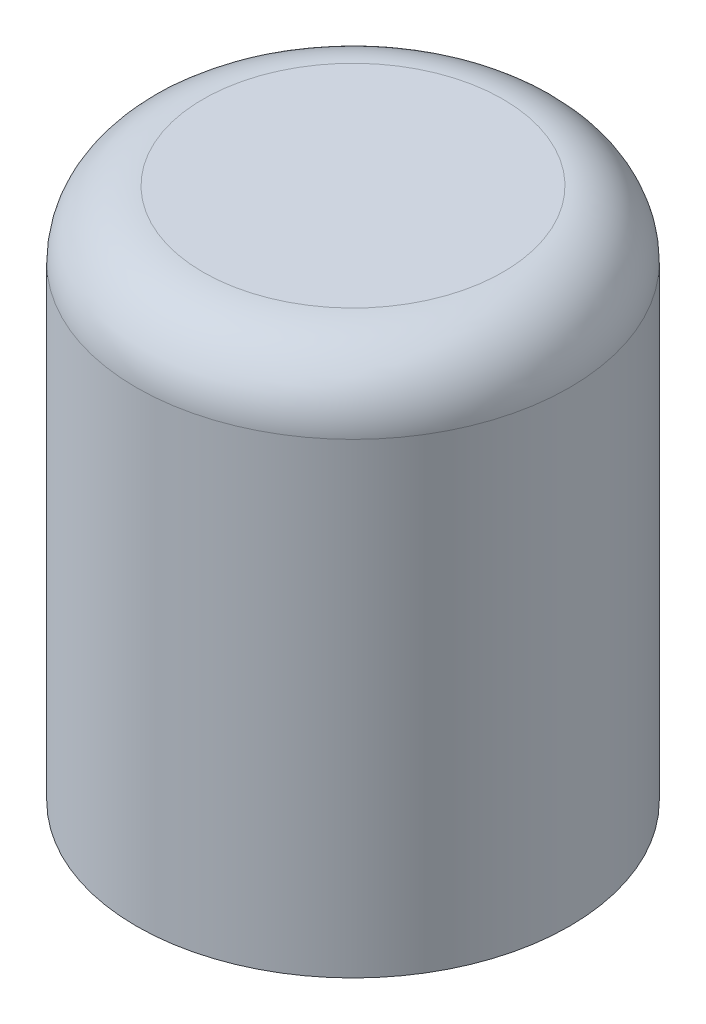
ISO-10303-21;
HEADER;
FILE_DESCRIPTION(('STEP AP214'),'2;1');
FILE_NAME('part.step','',(''),(''),'','','');
FILE_SCHEMA(('AUTOMOTIVE_DESIGN { 1 0 10303 214 1 1 1 1 }'));
ENDSEC;
DATA;
#1=APPLICATION_CONTEXT('core data for automotive mechanical design processes');
#2=APPLICATION_PROTOCOL_DEFINITION('international standard','automotive_design',2000,#1);
#3=PRODUCT_CONTEXT('',#1,'mechanical');
#4=PRODUCT('Part','Part','',(#3));
#5=PRODUCT_RELATED_PRODUCT_CATEGORY('part','',(#4));
#6=PRODUCT_DEFINITION_FORMATION('','',#4);
#7=PRODUCT_DEFINITION_CONTEXT('part definition',#1,'design');
#8=PRODUCT_DEFINITION('design','',#6,#7);
#9=PRODUCT_DEFINITION_SHAPE('','',#8);
#10=(LENGTH_UNIT() NAMED_UNIT(*) SI_UNIT(.MILLI.,.METRE.));
#11=(NAMED_UNIT(*) PLANE_ANGLE_UNIT() SI_UNIT($,.RADIAN.));
#12=(NAMED_UNIT(*) SI_UNIT($,.STERADIAN.) SOLID_ANGLE_UNIT());
#13=UNCERTAINTY_MEASURE_WITH_UNIT(LENGTH_MEASURE(1.E-05),#10,'distance_accuracy_value','');
#14=(GEOMETRIC_REPRESENTATION_CONTEXT(3) GLOBAL_UNCERTAINTY_ASSIGNED_CONTEXT((#13)) GLOBAL_UNIT_ASSIGNED_CONTEXT((#10,
#11,#12)) REPRESENTATION_CONTEXT('',''));
#15=CARTESIAN_POINT('',(0.,0.,0.));
#16=DIRECTION('',(0.,0.,1.));
#17=DIRECTION('',(1.,0.,0.));
#18=AXIS2_PLACEMENT_3D('',#15,#16,#17);
#19=CARTESIAN_POINT('',(0.,8.,0.));
#20=DIRECTION('',(0.,-1.,0.));
#21=DIRECTION('',(0.,0.,-1.));
#22=AXIS2_PLACEMENT_3D('',#19,#20,#21);
#23=CYLINDRICAL_SURFACE('',#22,3.25);
#24=CARTESIAN_POINT('',(0.,7.,0.));
#25=DIRECTION('',(0.,1.,0.));
#26=DIRECTION('',(0.,0.,1.));
#27=AXIS2_PLACEMENT_3D('',#24,#25,#26);
#28=CIRCLE('',#27,3.25);
#29=CARTESIAN_POINT('',(0.,7.,3.25));
#30=VERTEX_POINT('',#29);
#31=EDGE_CURVE('E10',#30,#30,#28,.F.);
#32=ORIENTED_EDGE('',*,*,#31,.T.);
#33=EDGE_LOOP('',(#32));
#34=FACE_BOUND('',#33,.T.);
#35=CARTESIAN_POINT('',(0.,0.,0.));
#36=DIRECTION('',(0.,1.,0.));
#37=DIRECTION('',(0.,0.,1.));
#38=AXIS2_PLACEMENT_3D('',#35,#36,#37);
#39=CIRCLE('',#38,3.25);
#40=CARTESIAN_POINT('',(0.,0.,3.25));
#41=VERTEX_POINT('',#40);
#42=EDGE_CURVE('E50',#41,#41,#39,.T.);
#43=ORIENTED_EDGE('',*,*,#42,.T.);
#44=EDGE_LOOP('',(#43));
#45=FACE_BOUND('',#44,.T.);
#46=ADVANCED_FACE('F37',(#34,#45),#23,.T.);
#47=CARTESIAN_POINT('',(0.,8.,0.));
#48=DIRECTION('',(0.,1.,0.));
#49=DIRECTION('',(0.,0.,1.));
#50=AXIS2_PLACEMENT_3D('',#47,#48,#49);
#51=PLANE('',#50);
#52=CARTESIAN_POINT('',(0.,8.,0.));
#53=DIRECTION('',(0.,1.,0.));
#54=DIRECTION('',(0.,0.,1.));
#55=AXIS2_PLACEMENT_3D('',#52,#53,#54);
#56=CIRCLE('',#55,2.25);
#57=CARTESIAN_POINT('',(0.,8.,2.25));
#58=VERTEX_POINT('',#57);
#59=EDGE_CURVE('E45',#58,#58,#56,.T.);
#60=ORIENTED_EDGE('',*,*,#59,.T.);
#61=EDGE_LOOP('',(#60));
#62=FACE_BOUND('',#61,.T.);
#63=ADVANCED_FACE('F71',(#62),#51,.T.);
#64=CARTESIAN_POINT('',(0.,0.,0.));
#65=DIRECTION('',(0.,1.,0.));
#66=DIRECTION('',(0.,0.,1.));
#67=AXIS2_PLACEMENT_3D('',#64,#65,#66);
#68=PLANE('',#67);
#69=CARTESIAN_POINT('',(0.,0.,0.));
#70=DIRECTION('',(0.,-1.,0.));
#71=DIRECTION('',(0.,0.,-1.));
#72=AXIS2_PLACEMENT_3D('',#69,#70,#71);
#73=CIRCLE('',#72,1.65);
#74=CARTESIAN_POINT('',(0.,0.,-1.65));
#75=VERTEX_POINT('',#74);
#76=EDGE_CURVE('E61',#75,#75,#73,.T.);
#77=ORIENTED_EDGE('',*,*,#76,.F.);
#78=EDGE_LOOP('',(#77));
#79=FACE_BOUND('',#78,.T.);
#80=ORIENTED_EDGE('',*,*,#42,.F.);
#81=EDGE_LOOP('',(#80));
#82=FACE_BOUND('',#81,.T.);
#83=ADVANCED_FACE('F68',(#79,#82),#68,.F.);
#84=CARTESIAN_POINT('',(0.,7.,0.));
#85=DIRECTION('',(0.,1.,0.));
#86=DIRECTION('',(0.,0.,1.));
#87=AXIS2_PLACEMENT_3D('',#84,#85,#86);
#88=TOROIDAL_SURFACE('',#87,2.25,1.);
#89=ORIENTED_EDGE('',*,*,#31,.F.);
#90=EDGE_LOOP('',(#89));
#91=FACE_BOUND('',#90,.T.);
#92=ORIENTED_EDGE('',*,*,#59,.F.);
#93=EDGE_LOOP('',(#92));
#94=FACE_BOUND('',#93,.T.);
#95=ADVANCED_FACE('F39',(#91,#94),#88,.T.);
#96=CARTESIAN_POINT('',(0.,0.,0.));
#97=DIRECTION('',(0.,-1.,0.));
#98=DIRECTION('',(0.,0.,-1.));
#99=AXIS2_PLACEMENT_3D('',#96,#97,#98);
#100=CONICAL_SURFACE('',#99,1.65,0.0296705972839037);
#101=CARTESIAN_POINT('',(0.,5.,0.));
#102=DIRECTION('',(0.,-1.,0.));
#103=DIRECTION('',(0.,0.,-1.));
#104=AXIS2_PLACEMENT_3D('',#101,#102,#103);
#105=CIRCLE('',#104,1.50160346434096);
#106=CARTESIAN_POINT('',(0.,5.,-1.50160346434096));
#107=VERTEX_POINT('',#106);
#108=EDGE_CURVE('E55',#107,#107,#105,.T.);
#109=ORIENTED_EDGE('',*,*,#108,.F.);
#110=EDGE_LOOP('',(#109));
#111=FACE_BOUND('',#110,.T.);
#112=ORIENTED_EDGE('',*,*,#76,.T.);
#113=EDGE_LOOP('',(#112));
#114=FACE_BOUND('',#113,.T.);
#115=ADVANCED_FACE('F66',(#111,#114),#100,.F.);
#116=CARTESIAN_POINT('',(0.,5.,0.));
#117=DIRECTION('',(0.,-1.,0.));
#118=DIRECTION('',(0.,0.,-1.));
#119=AXIS2_PLACEMENT_3D('',#116,#117,#118);
#120=PLANE('',#119);
#121=ORIENTED_EDGE('',*,*,#108,.T.);
#122=EDGE_LOOP('',(#121));
#123=FACE_BOUND('',#122,.T.);
#124=ADVANCED_FACE('F83',(#123),#120,.T.);
#125=CLOSED_SHELL('',(#46,#63,#83,#95,#115,#124));
#126=MANIFOLD_SOLID_BREP('B2',#125);
#127=ADVANCED_BREP_SHAPE_REPRESENTATION('',(#18,#126),#14);
#128=SHAPE_DEFINITION_REPRESENTATION(#9,#127);
ENDSEC;
END-ISO-10303-21;
